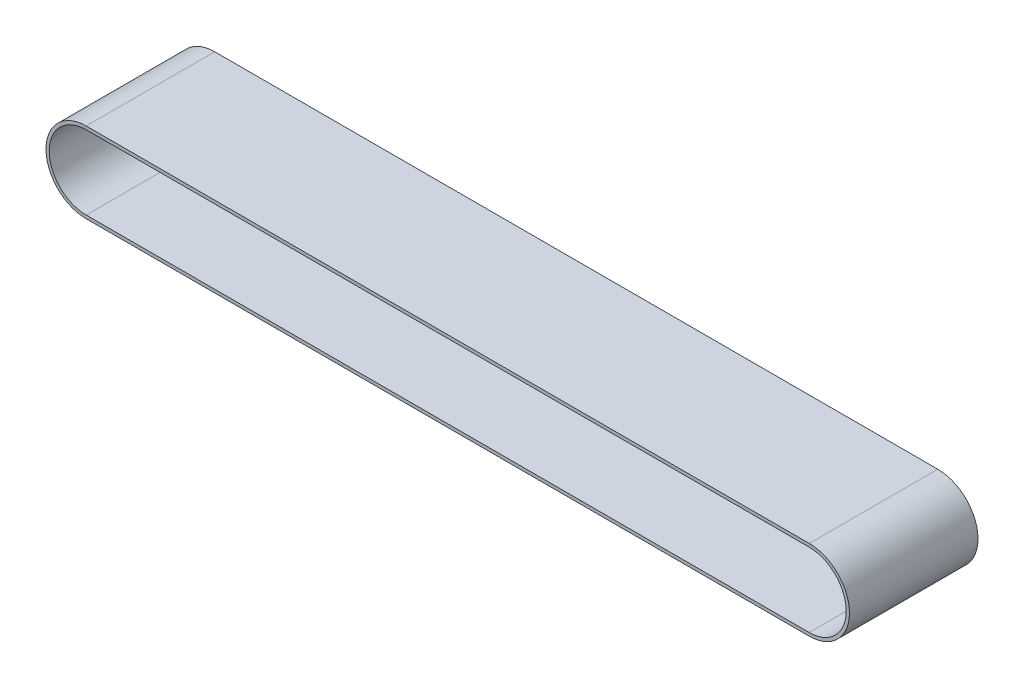
ISO-10303-21;
HEADER;
FILE_DESCRIPTION(('STEP AP214'),'2;1');
FILE_NAME('part.step','',(''),(''),'','','');
FILE_SCHEMA(('AUTOMOTIVE_DESIGN { 1 0 10303 214 1 1 1 1 }'));
ENDSEC;
DATA;
#1=APPLICATION_CONTEXT('core data for automotive mechanical design processes');
#2=APPLICATION_PROTOCOL_DEFINITION('international standard','automotive_design',2000,#1);
#3=PRODUCT_CONTEXT('',#1,'mechanical');
#4=PRODUCT('Part','Part','',(#3));
#5=PRODUCT_RELATED_PRODUCT_CATEGORY('part','',(#4));
#6=PRODUCT_DEFINITION_FORMATION('','',#4);
#7=PRODUCT_DEFINITION_CONTEXT('part definition',#1,'design');
#8=PRODUCT_DEFINITION('design','',#6,#7);
#9=PRODUCT_DEFINITION_SHAPE('','',#8);
#10=(LENGTH_UNIT() NAMED_UNIT(*) SI_UNIT(.MILLI.,.METRE.));
#11=(NAMED_UNIT(*) PLANE_ANGLE_UNIT() SI_UNIT($,.RADIAN.));
#12=(NAMED_UNIT(*) SI_UNIT($,.STERADIAN.) SOLID_ANGLE_UNIT());
#13=UNCERTAINTY_MEASURE_WITH_UNIT(LENGTH_MEASURE(1.E-05),#10,'distance_accuracy_value','');
#14=(GEOMETRIC_REPRESENTATION_CONTEXT(3) GLOBAL_UNCERTAINTY_ASSIGNED_CONTEXT((#13)) GLOBAL_UNIT_ASSIGNED_CONTEXT((#10,
#11,#12)) REPRESENTATION_CONTEXT('',''));
#15=CARTESIAN_POINT('',(0.,0.,0.));
#16=DIRECTION('',(0.,0.,1.));
#17=DIRECTION('',(1.,0.,0.));
#18=AXIS2_PLACEMENT_3D('',#15,#16,#17);
#19=CARTESIAN_POINT('',(0.,0.,-89.5));
#20=DIRECTION('',(0.,0.,1.));
#21=DIRECTION('',(1.,0.,0.));
#22=AXIS2_PLACEMENT_3D('',#19,#20,#21);
#23=CYLINDRICAL_SURFACE('',#22,25.);
#24=CARTESIAN_POINT('',(0.,0.,-9.5));
#25=DIRECTION('',(0.,0.,1.));
#26=DIRECTION('',(1.,0.,0.));
#27=AXIS2_PLACEMENT_3D('',#24,#25,#26);
#28=CIRCLE('',#27,25.);
#29=CARTESIAN_POINT('',(0.,25.,-9.5));
#30=VERTEX_POINT('',#29);
#31=CARTESIAN_POINT('',(0.,-25.,-9.5));
#32=VERTEX_POINT('',#31);
#33=EDGE_CURVE('E141',#30,#32,#28,.T.);
#34=ORIENTED_EDGE('',*,*,#33,.F.);
#35=DIRECTION('',(0.,0.,1.));
#36=VECTOR('',#35,1.);
#37=CARTESIAN_POINT('',(0.,25.,-89.5));
#38=LINE('',#37,#36);
#39=CARTESIAN_POINT('',(0.,25.,-89.5));
#40=VERTEX_POINT('',#39);
#41=EDGE_CURVE('E11',#40,#30,#38,.T.);
#42=ORIENTED_EDGE('',*,*,#41,.F.);
#43=CARTESIAN_POINT('',(0.,0.,-89.5));
#44=DIRECTION('',(0.,0.,1.));
#45=DIRECTION('',(1.,0.,0.));
#46=AXIS2_PLACEMENT_3D('',#43,#44,#45);
#47=CIRCLE('',#46,25.);
#48=CARTESIAN_POINT('',(0.,-25.,-89.5));
#49=VERTEX_POINT('',#48);
#50=EDGE_CURVE('E145',#40,#49,#47,.T.);
#51=ORIENTED_EDGE('',*,*,#50,.T.);
#52=DIRECTION('',(0.,0.,1.));
#53=VECTOR('',#52,1.);
#54=CARTESIAN_POINT('',(0.,-25.,-89.5));
#55=LINE('',#54,#53);
#56=EDGE_CURVE('E46',#49,#32,#55,.T.);
#57=ORIENTED_EDGE('',*,*,#56,.T.);
#58=EDGE_LOOP('',(#34,#42,#51,#57));
#59=FACE_BOUND('',#58,.T.);
#60=ADVANCED_FACE('F43',(#59),#23,.T.);
#61=CARTESIAN_POINT('',(0.,25.,-89.5));
#62=DIRECTION('',(0.,1.,0.));
#63=DIRECTION('',(0.,0.,1.));
#64=AXIS2_PLACEMENT_3D('',#61,#62,#63);
#65=PLANE('',#64);
#66=DIRECTION('',(-1.,0.,0.));
#67=VECTOR('',#66,1.);
#68=CARTESIAN_POINT('',(0.,25.,-9.5));
#69=LINE('',#68,#67);
#70=CARTESIAN_POINT('',(450.,25.0000000000001,-9.5));
#71=VERTEX_POINT('',#70);
#72=EDGE_CURVE('E149',#71,#30,#69,.T.);
#73=ORIENTED_EDGE('',*,*,#72,.F.);
#74=DIRECTION('',(0.,0.,1.));
#75=VECTOR('',#74,1.);
#76=CARTESIAN_POINT('',(450.,25.0000000000001,-89.5));
#77=LINE('',#76,#75);
#78=CARTESIAN_POINT('',(450.,25.0000000000001,-89.5));
#79=VERTEX_POINT('',#78);
#80=EDGE_CURVE('E51',#79,#71,#77,.T.);
#81=ORIENTED_EDGE('',*,*,#80,.F.);
#82=DIRECTION('',(-1.,0.,0.));
#83=VECTOR('',#82,1.);
#84=CARTESIAN_POINT('',(435.,25.,-89.5));
#85=LINE('',#84,#83);
#86=EDGE_CURVE('E155',#79,#40,#85,.T.);
#87=ORIENTED_EDGE('',*,*,#86,.T.);
#88=ORIENTED_EDGE('',*,*,#41,.T.);
#89=EDGE_LOOP('',(#73,#81,#87,#88));
#90=FACE_BOUND('',#89,.T.);
#91=ADVANCED_FACE('F182',(#90),#65,.T.);
#92=CARTESIAN_POINT('',(450.,0.,-89.5));
#93=DIRECTION('',(0.,0.,1.));
#94=DIRECTION('',(1.,0.,0.));
#95=AXIS2_PLACEMENT_3D('',#92,#93,#94);
#96=CYLINDRICAL_SURFACE('',#95,25.);
#97=CARTESIAN_POINT('',(450.,0.,-9.5));
#98=DIRECTION('',(0.,0.,1.));
#99=DIRECTION('',(1.,0.,0.));
#100=AXIS2_PLACEMENT_3D('',#97,#98,#99);
#101=CIRCLE('',#100,25.);
#102=CARTESIAN_POINT('',(450.,-25.,-9.5));
#103=VERTEX_POINT('',#102);
#104=EDGE_CURVE('E162',#103,#71,#101,.T.);
#105=ORIENTED_EDGE('',*,*,#104,.F.);
#106=DIRECTION('',(0.,0.,1.));
#107=VECTOR('',#106,1.);
#108=CARTESIAN_POINT('',(450.,-25.,-89.5));
#109=LINE('',#108,#107);
#110=CARTESIAN_POINT('',(450.,-25.,-89.5));
#111=VERTEX_POINT('',#110);
#112=EDGE_CURVE('E168',#111,#103,#109,.T.);
#113=ORIENTED_EDGE('',*,*,#112,.F.);
#114=CARTESIAN_POINT('',(450.,0.,-89.5));
#115=DIRECTION('',(0.,0.,1.));
#116=DIRECTION('',(1.,0.,0.));
#117=AXIS2_PLACEMENT_3D('',#114,#115,#116);
#118=CIRCLE('',#117,25.);
#119=EDGE_CURVE('E152',#111,#79,#118,.T.);
#120=ORIENTED_EDGE('',*,*,#119,.T.);
#121=ORIENTED_EDGE('',*,*,#80,.T.);
#122=EDGE_LOOP('',(#105,#113,#120,#121));
#123=FACE_BOUND('',#122,.T.);
#124=ADVANCED_FACE('F185',(#123),#96,.T.);
#125=CARTESIAN_POINT('',(450.,-25.,-89.5));
#126=DIRECTION('',(0.,-1.,0.));
#127=DIRECTION('',(1.,0.,0.));
#128=AXIS2_PLACEMENT_3D('',#125,#126,#127);
#129=PLANE('',#128);
#130=DIRECTION('',(1.,0.,0.));
#131=VECTOR('',#130,1.);
#132=CARTESIAN_POINT('',(450.,-25.,-9.5));
#133=LINE('',#132,#131);
#134=EDGE_CURVE('E159',#32,#103,#133,.T.);
#135=ORIENTED_EDGE('',*,*,#134,.F.);
#136=ORIENTED_EDGE('',*,*,#56,.F.);
#137=DIRECTION('',(1.,0.,0.));
#138=VECTOR('',#137,1.);
#139=CARTESIAN_POINT('',(450.,-25.,-89.5));
#140=LINE('',#139,#138);
#141=EDGE_CURVE('E148',#49,#111,#140,.T.);
#142=ORIENTED_EDGE('',*,*,#141,.T.);
#143=ORIENTED_EDGE('',*,*,#112,.T.);
#144=EDGE_LOOP('',(#135,#136,#142,#143));
#145=FACE_BOUND('',#144,.T.);
#146=ADVANCED_FACE('F178',(#145),#129,.T.);
#147=CARTESIAN_POINT('',(0.,0.,-89.5));
#148=DIRECTION('',(0.,0.,1.));
#149=DIRECTION('',(1.,0.,0.));
#150=AXIS2_PLACEMENT_3D('',#147,#148,#149);
#151=PLANE('',#150);
#152=DIRECTION('',(-1.,0.,0.));
#153=VECTOR('',#152,1.);
#154=CARTESIAN_POINT('',(435.,23.0000000000001,-89.5));
#155=LINE('',#154,#153);
#156=CARTESIAN_POINT('',(450.,23.,-89.5));
#157=VERTEX_POINT('',#156);
#158=CARTESIAN_POINT('',(0.,23.,-89.5));
#159=VERTEX_POINT('',#158);
#160=EDGE_CURVE('E116',#157,#159,#155,.T.);
#161=ORIENTED_EDGE('',*,*,#160,.T.);
#162=CARTESIAN_POINT('',(0.,0.,-89.5));
#163=DIRECTION('',(0.,0.,1.));
#164=DIRECTION('',(1.,0.,0.));
#165=AXIS2_PLACEMENT_3D('',#162,#163,#164);
#166=CIRCLE('',#165,23.);
#167=CARTESIAN_POINT('',(0.,-23.,-89.5));
#168=VERTEX_POINT('',#167);
#169=EDGE_CURVE('E110',#159,#168,#166,.T.);
#170=ORIENTED_EDGE('',*,*,#169,.T.);
#171=DIRECTION('',(1.,0.,0.));
#172=VECTOR('',#171,1.);
#173=CARTESIAN_POINT('',(450.,-23.,-89.5));
#174=LINE('',#173,#172);
#175=CARTESIAN_POINT('',(450.,-23.,-89.5));
#176=VERTEX_POINT('',#175);
#177=EDGE_CURVE('E119',#168,#176,#174,.T.);
#178=ORIENTED_EDGE('',*,*,#177,.T.);
#179=CARTESIAN_POINT('',(450.,0.,-89.5));
#180=DIRECTION('',(0.,0.,1.));
#181=DIRECTION('',(1.,0.,0.));
#182=AXIS2_PLACEMENT_3D('',#179,#180,#181);
#183=CIRCLE('',#182,23.);
#184=EDGE_CURVE('E59',#176,#157,#183,.T.);
#185=ORIENTED_EDGE('',*,*,#184,.T.);
#186=EDGE_LOOP('',(#161,#170,#178,#185));
#187=FACE_BOUND('',#186,.T.);
#188=ORIENTED_EDGE('',*,*,#50,.F.);
#189=ORIENTED_EDGE('',*,*,#86,.F.);
#190=ORIENTED_EDGE('',*,*,#119,.F.);
#191=ORIENTED_EDGE('',*,*,#141,.F.);
#192=EDGE_LOOP('',(#188,#189,#190,#191));
#193=FACE_BOUND('',#192,.T.);
#194=ADVANCED_FACE('F123',(#187,#193),#151,.F.);
#195=CARTESIAN_POINT('',(0.,0.,-9.5));
#196=DIRECTION('',(0.,0.,1.));
#197=DIRECTION('',(1.,0.,0.));
#198=AXIS2_PLACEMENT_3D('',#195,#196,#197);
#199=PLANE('',#198);
#200=CARTESIAN_POINT('',(0.,0.,-9.5));
#201=DIRECTION('',(0.,0.,1.));
#202=DIRECTION('',(1.,0.,0.));
#203=AXIS2_PLACEMENT_3D('',#200,#201,#202);
#204=CIRCLE('',#203,23.);
#205=CARTESIAN_POINT('',(0.,23.,-9.5));
#206=VERTEX_POINT('',#205);
#207=CARTESIAN_POINT('',(0.,-23.,-9.5));
#208=VERTEX_POINT('',#207);
#209=EDGE_CURVE('E67',#206,#208,#204,.T.);
#210=ORIENTED_EDGE('',*,*,#209,.F.);
#211=DIRECTION('',(-1.,0.,0.));
#212=VECTOR('',#211,1.);
#213=CARTESIAN_POINT('',(0.,23.,-9.5));
#214=LINE('',#213,#212);
#215=CARTESIAN_POINT('',(450.,23.,-9.5));
#216=VERTEX_POINT('',#215);
#217=EDGE_CURVE('E126',#216,#206,#214,.T.);
#218=ORIENTED_EDGE('',*,*,#217,.F.);
#219=CARTESIAN_POINT('',(450.,0.,-9.5));
#220=DIRECTION('',(0.,0.,1.));
#221=DIRECTION('',(1.,0.,0.));
#222=AXIS2_PLACEMENT_3D('',#219,#220,#221);
#223=CIRCLE('',#222,23.);
#224=CARTESIAN_POINT('',(450.,-23.,-9.5));
#225=VERTEX_POINT('',#224);
#226=EDGE_CURVE('E129',#225,#216,#223,.T.);
#227=ORIENTED_EDGE('',*,*,#226,.F.);
#228=DIRECTION('',(1.,0.,0.));
#229=VECTOR('',#228,1.);
#230=CARTESIAN_POINT('',(450.,-23.,-9.5));
#231=LINE('',#230,#229);
#232=EDGE_CURVE('E135',#208,#225,#231,.T.);
#233=ORIENTED_EDGE('',*,*,#232,.F.);
#234=EDGE_LOOP('',(#210,#218,#227,#233));
#235=FACE_BOUND('',#234,.T.);
#236=ORIENTED_EDGE('',*,*,#33,.T.);
#237=ORIENTED_EDGE('',*,*,#134,.T.);
#238=ORIENTED_EDGE('',*,*,#104,.T.);
#239=ORIENTED_EDGE('',*,*,#72,.T.);
#240=EDGE_LOOP('',(#236,#237,#238,#239));
#241=FACE_BOUND('',#240,.T.);
#242=ADVANCED_FACE('F180',(#235,#241),#199,.T.);
#243=CARTESIAN_POINT('',(0.,0.,-89.5));
#244=DIRECTION('',(0.,0.,1.));
#245=DIRECTION('',(1.,0.,0.));
#246=AXIS2_PLACEMENT_3D('',#243,#244,#245);
#247=CYLINDRICAL_SURFACE('',#246,23.);
#248=ORIENTED_EDGE('',*,*,#209,.T.);
#249=DIRECTION('',(0.,0.,1.));
#250=VECTOR('',#249,1.);
#251=CARTESIAN_POINT('',(0.,-23.,-89.5));
#252=LINE('',#251,#250);
#253=EDGE_CURVE('E106',#168,#208,#252,.T.);
#254=ORIENTED_EDGE('',*,*,#253,.F.);
#255=ORIENTED_EDGE('',*,*,#169,.F.);
#256=DIRECTION('',(0.,0.,1.));
#257=VECTOR('',#256,1.);
#258=CARTESIAN_POINT('',(0.,23.,-89.5));
#259=LINE('',#258,#257);
#260=EDGE_CURVE('E139',#159,#206,#259,.T.);
#261=ORIENTED_EDGE('',*,*,#260,.T.);
#262=EDGE_LOOP('',(#248,#254,#255,#261));
#263=FACE_BOUND('',#262,.T.);
#264=ADVANCED_FACE('F108',(#263),#247,.F.);
#265=CARTESIAN_POINT('',(0.,23.,-89.5));
#266=DIRECTION('',(0.,1.,0.));
#267=DIRECTION('',(-1.,0.,0.));
#268=AXIS2_PLACEMENT_3D('',#265,#266,#267);
#269=PLANE('',#268);
#270=ORIENTED_EDGE('',*,*,#217,.T.);
#271=ORIENTED_EDGE('',*,*,#260,.F.);
#272=ORIENTED_EDGE('',*,*,#160,.F.);
#273=DIRECTION('',(0.,0.,1.));
#274=VECTOR('',#273,1.);
#275=CARTESIAN_POINT('',(450.,23.,-89.5));
#276=LINE('',#275,#274);
#277=EDGE_CURVE('E142',#157,#216,#276,.T.);
#278=ORIENTED_EDGE('',*,*,#277,.T.);
#279=EDGE_LOOP('',(#270,#271,#272,#278));
#280=FACE_BOUND('',#279,.T.);
#281=ADVANCED_FACE('F212',(#280),#269,.F.);
#282=CARTESIAN_POINT('',(450.,0.,-89.5));
#283=DIRECTION('',(0.,0.,1.));
#284=DIRECTION('',(1.,0.,0.));
#285=AXIS2_PLACEMENT_3D('',#282,#283,#284);
#286=CYLINDRICAL_SURFACE('',#285,23.);
#287=ORIENTED_EDGE('',*,*,#226,.T.);
#288=ORIENTED_EDGE('',*,*,#277,.F.);
#289=ORIENTED_EDGE('',*,*,#184,.F.);
#290=DIRECTION('',(0.,0.,1.));
#291=VECTOR('',#290,1.);
#292=CARTESIAN_POINT('',(450.,-23.,-89.5));
#293=LINE('',#292,#291);
#294=EDGE_CURVE('E115',#176,#225,#293,.T.);
#295=ORIENTED_EDGE('',*,*,#294,.T.);
#296=EDGE_LOOP('',(#287,#288,#289,#295));
#297=FACE_BOUND('',#296,.T.);
#298=ADVANCED_FACE('F210',(#297),#286,.F.);
#299=CARTESIAN_POINT('',(450.,-23.,-89.5));
#300=DIRECTION('',(0.,-1.,0.));
#301=DIRECTION('',(1.,0.,0.));
#302=AXIS2_PLACEMENT_3D('',#299,#300,#301);
#303=PLANE('',#302);
#304=ORIENTED_EDGE('',*,*,#232,.T.);
#305=ORIENTED_EDGE('',*,*,#294,.F.);
#306=ORIENTED_EDGE('',*,*,#177,.F.);
#307=ORIENTED_EDGE('',*,*,#253,.T.);
#308=EDGE_LOOP('',(#304,#305,#306,#307));
#309=FACE_BOUND('',#308,.T.);
#310=ADVANCED_FACE('F120',(#309),#303,.F.);
#311=CLOSED_SHELL('',(#60,#91,#124,#146,#194,#242,#264,#281,#298,#310));
#312=MANIFOLD_SOLID_BREP('B2',#311);
#313=ADVANCED_BREP_SHAPE_REPRESENTATION('',(#18,#312),#14);
#314=SHAPE_DEFINITION_REPRESENTATION(#9,#313);
ENDSEC;
END-ISO-10303-21;
